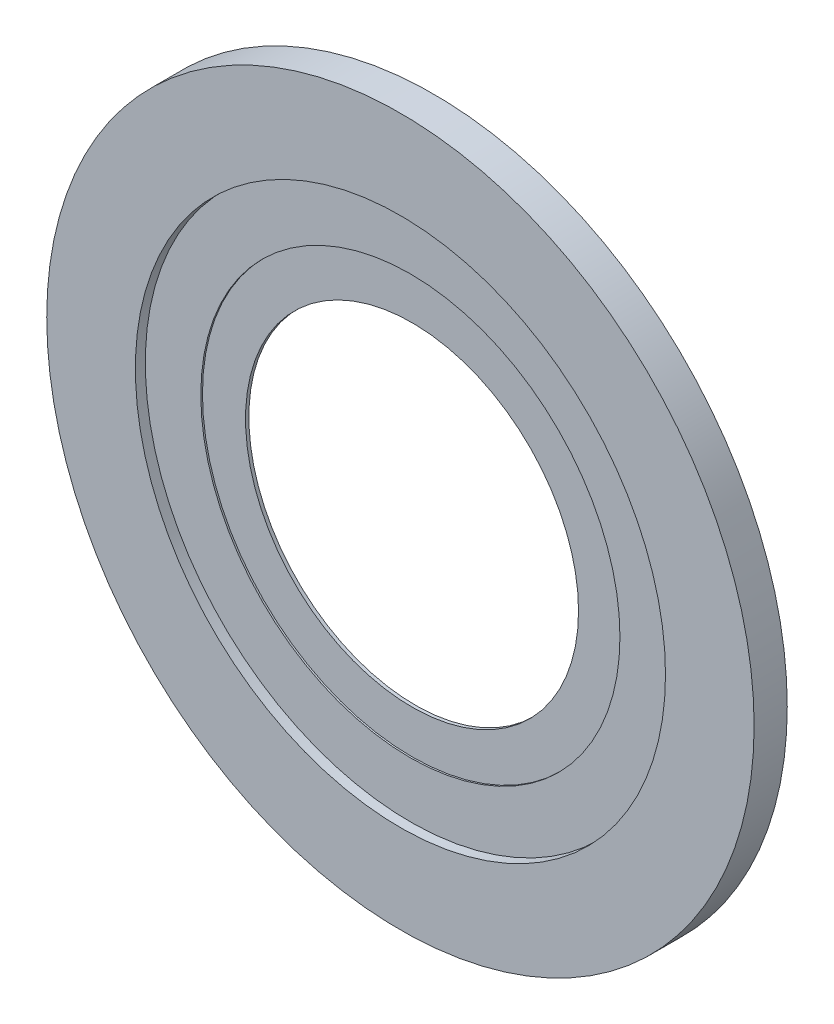
ISO-10303-21;
HEADER;
FILE_DESCRIPTION(('STEP AP214'),'2;1');
FILE_NAME('part.step','',(''),(''),'','','');
FILE_SCHEMA(('AUTOMOTIVE_DESIGN { 1 0 10303 214 1 1 1 1 }'));
ENDSEC;
DATA;
#1=APPLICATION_CONTEXT('core data for automotive mechanical design processes');
#2=APPLICATION_PROTOCOL_DEFINITION('international standard','automotive_design',2000,#1);
#3=PRODUCT_CONTEXT('',#1,'mechanical');
#4=PRODUCT('Part','Part','',(#3));
#5=PRODUCT_RELATED_PRODUCT_CATEGORY('part','',(#4));
#6=PRODUCT_DEFINITION_FORMATION('','',#4);
#7=PRODUCT_DEFINITION_CONTEXT('part definition',#1,'design');
#8=PRODUCT_DEFINITION('design','',#6,#7);
#9=PRODUCT_DEFINITION_SHAPE('','',#8);
#10=(LENGTH_UNIT() NAMED_UNIT(*) SI_UNIT(.MILLI.,.METRE.));
#11=(NAMED_UNIT(*) PLANE_ANGLE_UNIT() SI_UNIT($,.RADIAN.));
#12=(NAMED_UNIT(*) SI_UNIT($,.STERADIAN.) SOLID_ANGLE_UNIT());
#13=UNCERTAINTY_MEASURE_WITH_UNIT(LENGTH_MEASURE(1.E-05),#10,'distance_accuracy_value','');
#14=(GEOMETRIC_REPRESENTATION_CONTEXT(3) GLOBAL_UNCERTAINTY_ASSIGNED_CONTEXT((#13)) GLOBAL_UNIT_ASSIGNED_CONTEXT((#10,
#11,#12)) REPRESENTATION_CONTEXT('',''));
#15=CARTESIAN_POINT('',(0.,0.,0.));
#16=DIRECTION('',(0.,0.,1.));
#17=DIRECTION('',(1.,0.,0.));
#18=AXIS2_PLACEMENT_3D('',#15,#16,#17);
#19=CARTESIAN_POINT('',(0.,0.,0.));
#20=DIRECTION('',(0.,0.,1.));
#21=DIRECTION('',(1.,0.,0.));
#22=AXIS2_PLACEMENT_3D('',#19,#20,#21);
#23=CYLINDRICAL_SURFACE('',#22,10.05);
#24=CARTESIAN_POINT('',(0.,0.,1.1));
#25=DIRECTION('',(0.,0.,1.));
#26=DIRECTION('',(1.,0.,0.));
#27=AXIS2_PLACEMENT_3D('',#24,#25,#26);
#28=CIRCLE('',#27,10.05);
#29=CARTESIAN_POINT('',(10.05,0.,1.1));
#30=VERTEX_POINT('',#29);
#31=EDGE_CURVE('E12',#30,#30,#28,.F.);
#32=ORIENTED_EDGE('',*,*,#31,.T.);
#33=EDGE_LOOP('',(#32));
#34=FACE_BOUND('',#33,.T.);
#35=CARTESIAN_POINT('',(0.,0.,1.3));
#36=DIRECTION('',(0.,0.,1.));
#37=DIRECTION('',(1.,0.,0.));
#38=AXIS2_PLACEMENT_3D('',#35,#36,#37);
#39=CIRCLE('',#38,10.05);
#40=CARTESIAN_POINT('',(10.05,0.,1.3));
#41=VERTEX_POINT('',#40);
#42=EDGE_CURVE('E49',#41,#41,#39,.F.);
#43=ORIENTED_EDGE('',*,*,#42,.F.);
#44=EDGE_LOOP('',(#43));
#45=FACE_BOUND('',#44,.T.);
#46=ADVANCED_FACE('F45',(#34,#45),#23,.F.);
#47=CARTESIAN_POINT('',(0.,0.,2.));
#48=DIRECTION('',(0.,0.,-1.));
#49=DIRECTION('',(-1.,0.,0.));
#50=AXIS2_PLACEMENT_3D('',#47,#48,#49);
#51=CYLINDRICAL_SURFACE('',#50,21.35);
#52=CARTESIAN_POINT('',(0.,0.,2.));
#53=DIRECTION('',(0.,0.,1.));
#54=DIRECTION('',(1.,0.,0.));
#55=AXIS2_PLACEMENT_3D('',#52,#53,#54);
#56=CIRCLE('',#55,21.35);
#57=CARTESIAN_POINT('',(21.35,0.,2.));
#58=VERTEX_POINT('',#57);
#59=EDGE_CURVE('E57',#58,#58,#56,.T.);
#60=ORIENTED_EDGE('',*,*,#59,.F.);
#61=EDGE_LOOP('',(#60));
#62=FACE_BOUND('',#61,.T.);
#63=CARTESIAN_POINT('',(0.,0.,0.));
#64=DIRECTION('',(0.,0.,1.));
#65=DIRECTION('',(1.,0.,0.));
#66=AXIS2_PLACEMENT_3D('',#63,#64,#65);
#67=CIRCLE('',#66,21.35);
#68=CARTESIAN_POINT('',(21.35,0.,0.));
#69=VERTEX_POINT('',#68);
#70=EDGE_CURVE('E60',#69,#69,#67,.T.);
#71=ORIENTED_EDGE('',*,*,#70,.T.);
#72=EDGE_LOOP('',(#71));
#73=FACE_BOUND('',#72,.T.);
#74=ADVANCED_FACE('F84',(#62,#73),#51,.T.);
#75=CARTESIAN_POINT('',(0.,0.,2.));
#76=DIRECTION('',(0.,0.,1.));
#77=DIRECTION('',(1.,0.,0.));
#78=AXIS2_PLACEMENT_3D('',#75,#76,#77);
#79=PLANE('',#78);
#80=CARTESIAN_POINT('',(0.,0.,2.));
#81=DIRECTION('',(0.,0.,1.));
#82=DIRECTION('',(1.,0.,0.));
#83=AXIS2_PLACEMENT_3D('',#80,#81,#82);
#84=CIRCLE('',#83,16.);
#85=CARTESIAN_POINT('',(16.,0.,2.));
#86=VERTEX_POINT('',#85);
#87=EDGE_CURVE('E66',#86,#86,#84,.T.);
#88=ORIENTED_EDGE('',*,*,#87,.F.);
#89=EDGE_LOOP('',(#88));
#90=FACE_BOUND('',#89,.T.);
#91=ORIENTED_EDGE('',*,*,#59,.T.);
#92=EDGE_LOOP('',(#91));
#93=FACE_BOUND('',#92,.T.);
#94=ADVANCED_FACE('F89',(#90,#93),#79,.T.);
#95=CARTESIAN_POINT('',(0.,0.,0.));
#96=DIRECTION('',(0.,0.,1.));
#97=DIRECTION('',(1.,0.,0.));
#98=AXIS2_PLACEMENT_3D('',#95,#96,#97);
#99=PLANE('',#98);
#100=CARTESIAN_POINT('',(0.,0.,0.));
#101=DIRECTION('',(0.,0.,1.));
#102=DIRECTION('',(1.,0.,0.));
#103=AXIS2_PLACEMENT_3D('',#100,#101,#102);
#104=CIRCLE('',#103,16.2884100015795);
#105=CARTESIAN_POINT('',(16.2884100015795,0.,0.));
#106=VERTEX_POINT('',#105);
#107=EDGE_CURVE('E53',#106,#106,#104,.T.);
#108=ORIENTED_EDGE('',*,*,#107,.T.);
#109=EDGE_LOOP('',(#108));
#110=FACE_BOUND('',#109,.T.);
#111=ORIENTED_EDGE('',*,*,#70,.F.);
#112=EDGE_LOOP('',(#111));
#113=FACE_BOUND('',#112,.T.);
#114=ADVANCED_FACE('F97',(#110,#113),#99,.F.);
#115=CARTESIAN_POINT('',(0.,0.,1.4));
#116=DIRECTION('',(0.,0.,1.));
#117=DIRECTION('',(1.,0.,0.));
#118=AXIS2_PLACEMENT_3D('',#115,#116,#117);
#119=PLANE('',#118);
#120=CARTESIAN_POINT('',(0.,0.,1.4));
#121=DIRECTION('',(0.,0.,1.));
#122=DIRECTION('',(1.,0.,0.));
#123=AXIS2_PLACEMENT_3D('',#120,#121,#122);
#124=CIRCLE('',#123,12.65);
#125=CARTESIAN_POINT('',(12.65,0.,1.4));
#126=VERTEX_POINT('',#125);
#127=EDGE_CURVE('E71',#126,#126,#124,.T.);
#128=ORIENTED_EDGE('',*,*,#127,.F.);
#129=EDGE_LOOP('',(#128));
#130=FACE_BOUND('',#129,.T.);
#131=CARTESIAN_POINT('',(0.,0.,1.4));
#132=DIRECTION('',(0.,0.,1.));
#133=DIRECTION('',(1.,0.,0.));
#134=AXIS2_PLACEMENT_3D('',#131,#132,#133);
#135=CIRCLE('',#134,16.);
#136=CARTESIAN_POINT('',(16.,0.,1.4));
#137=VERTEX_POINT('',#136);
#138=EDGE_CURVE('E63',#137,#137,#135,.T.);
#139=ORIENTED_EDGE('',*,*,#138,.T.);
#140=EDGE_LOOP('',(#139));
#141=FACE_BOUND('',#140,.T.);
#142=ADVANCED_FACE('F100',(#130,#141),#119,.T.);
#143=CARTESIAN_POINT('',(0.,0.,1.4));
#144=DIRECTION('',(0.,0.,1.));
#145=DIRECTION('',(1.,0.,0.));
#146=AXIS2_PLACEMENT_3D('',#143,#144,#145);
#147=CYLINDRICAL_SURFACE('',#146,16.);
#148=ORIENTED_EDGE('',*,*,#138,.F.);
#149=EDGE_LOOP('',(#148));
#150=FACE_BOUND('',#149,.T.);
#151=ORIENTED_EDGE('',*,*,#87,.T.);
#152=EDGE_LOOP('',(#151));
#153=FACE_BOUND('',#152,.T.);
#154=ADVANCED_FACE('F93',(#150,#153),#147,.F.);
#155=CARTESIAN_POINT('',(0.,0.,0.));
#156=DIRECTION('',(0.,0.,-1.));
#157=DIRECTION('',(-1.,0.,0.));
#158=AXIS2_PLACEMENT_3D('',#155,#156,#157);
#159=CONICAL_SURFACE('',#158,16.2884100015795,1.39626340159546);
#160=ORIENTED_EDGE('',*,*,#31,.F.);
#161=EDGE_LOOP('',(#160));
#162=FACE_BOUND('',#161,.T.);
#163=ORIENTED_EDGE('',*,*,#107,.F.);
#164=EDGE_LOOP('',(#163));
#165=FACE_BOUND('',#164,.T.);
#166=ADVANCED_FACE('F47',(#162,#165),#159,.F.);
#167=CARTESIAN_POINT('',(0.,0.,1.3));
#168=DIRECTION('',(0.,0.,1.));
#169=DIRECTION('',(1.,0.,0.));
#170=AXIS2_PLACEMENT_3D('',#167,#168,#169);
#171=PLANE('',#170);
#172=CARTESIAN_POINT('',(0.,0.,1.3));
#173=DIRECTION('',(0.,0.,1.));
#174=DIRECTION('',(1.,0.,0.));
#175=AXIS2_PLACEMENT_3D('',#172,#173,#174);
#176=CIRCLE('',#175,12.65);
#177=CARTESIAN_POINT('',(12.65,0.,1.3));
#178=VERTEX_POINT('',#177);
#179=EDGE_CURVE('E74',#178,#178,#176,.T.);
#180=ORIENTED_EDGE('',*,*,#179,.T.);
#181=EDGE_LOOP('',(#180));
#182=FACE_BOUND('',#181,.T.);
#183=ORIENTED_EDGE('',*,*,#42,.T.);
#184=EDGE_LOOP('',(#183));
#185=FACE_BOUND('',#184,.T.);
#186=ADVANCED_FACE('F81',(#182,#185),#171,.T.);
#187=CARTESIAN_POINT('',(0.,0.,1.3));
#188=DIRECTION('',(0.,0.,1.));
#189=DIRECTION('',(1.,0.,0.));
#190=AXIS2_PLACEMENT_3D('',#187,#188,#189);
#191=CYLINDRICAL_SURFACE('',#190,12.65);
#192=ORIENTED_EDGE('',*,*,#179,.F.);
#193=EDGE_LOOP('',(#192));
#194=FACE_BOUND('',#193,.T.);
#195=ORIENTED_EDGE('',*,*,#127,.T.);
#196=EDGE_LOOP('',(#195));
#197=FACE_BOUND('',#196,.T.);
#198=ADVANCED_FACE('F117',(#194,#197),#191,.F.);
#199=CLOSED_SHELL('',(#46,#74,#94,#114,#142,#154,#166,#186,#198));
#200=MANIFOLD_SOLID_BREP('B2',#199);
#201=ADVANCED_BREP_SHAPE_REPRESENTATION('',(#18,#200),#14);
#202=SHAPE_DEFINITION_REPRESENTATION(#9,#201);
ENDSEC;
END-ISO-10303-21;
